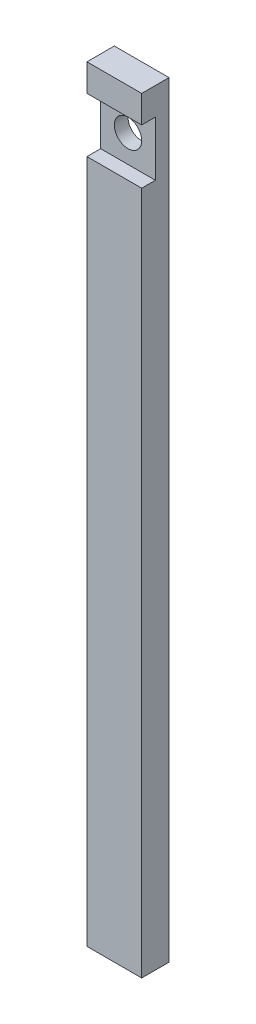
ISO-10303-21;
HEADER;
FILE_DESCRIPTION(('STEP AP214'),'2;1');
FILE_NAME('part.step','',(''),(''),'','','');
FILE_SCHEMA(('AUTOMOTIVE_DESIGN { 1 0 10303 214 1 1 1 1 }'));
ENDSEC;
DATA;
#1=APPLICATION_CONTEXT('core data for automotive mechanical design processes');
#2=APPLICATION_PROTOCOL_DEFINITION('international standard','automotive_design',2000,#1);
#3=PRODUCT_CONTEXT('',#1,'mechanical');
#4=PRODUCT('Part','Part','',(#3));
#5=PRODUCT_RELATED_PRODUCT_CATEGORY('part','',(#4));
#6=PRODUCT_DEFINITION_FORMATION('','',#4);
#7=PRODUCT_DEFINITION_CONTEXT('part definition',#1,'design');
#8=PRODUCT_DEFINITION('design','',#6,#7);
#9=PRODUCT_DEFINITION_SHAPE('','',#8);
#10=(LENGTH_UNIT() NAMED_UNIT(*) SI_UNIT(.MILLI.,.METRE.));
#11=(NAMED_UNIT(*) PLANE_ANGLE_UNIT() SI_UNIT($,.RADIAN.));
#12=(NAMED_UNIT(*) SI_UNIT($,.STERADIAN.) SOLID_ANGLE_UNIT());
#13=UNCERTAINTY_MEASURE_WITH_UNIT(LENGTH_MEASURE(1.E-05),#10,'distance_accuracy_value','');
#14=(GEOMETRIC_REPRESENTATION_CONTEXT(3) GLOBAL_UNCERTAINTY_ASSIGNED_CONTEXT((#13)) GLOBAL_UNIT_ASSIGNED_CONTEXT((#10,
#11,#12)) REPRESENTATION_CONTEXT('',''));
#15=CARTESIAN_POINT('',(0.,0.,0.));
#16=DIRECTION('',(0.,0.,1.));
#17=DIRECTION('',(1.,0.,0.));
#18=AXIS2_PLACEMENT_3D('',#15,#16,#17);
#19=CARTESIAN_POINT('',(0.,355.6,0.));
#20=DIRECTION('',(0.,0.,-1.));
#21=DIRECTION('',(-1.,0.,0.));
#22=AXIS2_PLACEMENT_3D('',#19,#20,#21);
#23=PLANE('',#22);
#24=DIRECTION('',(1.,0.,0.));
#25=VECTOR('',#24,1.);
#26=CARTESIAN_POINT('',(0.,317.5,0.));
#27=LINE('',#26,#25);
#28=CARTESIAN_POINT('',(0.,317.5,0.));
#29=VERTEX_POINT('',#28);
#30=CARTESIAN_POINT('',(25.4,317.5,0.));
#31=VERTEX_POINT('',#30);
#32=EDGE_CURVE('E111',#29,#31,#27,.T.);
#33=ORIENTED_EDGE('',*,*,#32,.F.);
#34=DIRECTION('',(0.,-1.,0.));
#35=VECTOR('',#34,1.);
#36=CARTESIAN_POINT('',(0.,355.6,0.));
#37=LINE('',#36,#35);
#38=CARTESIAN_POINT('',(0.,0.,0.));
#39=VERTEX_POINT('',#38);
#40=EDGE_CURVE('E50',#29,#39,#37,.T.);
#41=ORIENTED_EDGE('',*,*,#40,.T.);
#42=DIRECTION('',(1.,0.,0.));
#43=VECTOR('',#42,1.);
#44=CARTESIAN_POINT('',(0.,0.,0.));
#45=LINE('',#44,#43);
#46=CARTESIAN_POINT('',(25.4,0.,0.));
#47=VERTEX_POINT('',#46);
#48=EDGE_CURVE('E150',#39,#47,#45,.T.);
#49=ORIENTED_EDGE('',*,*,#48,.T.);
#50=DIRECTION('',(0.,-1.,0.));
#51=VECTOR('',#50,1.);
#52=CARTESIAN_POINT('',(25.4,355.6,0.));
#53=LINE('',#52,#51);
#54=EDGE_CURVE('E130',#31,#47,#53,.T.);
#55=ORIENTED_EDGE('',*,*,#54,.F.);
#56=EDGE_LOOP('',(#33,#41,#49,#55));
#57=FACE_BOUND('',#56,.T.);
#58=ADVANCED_FACE('F39',(#57),#23,.F.);
#59=CARTESIAN_POINT('',(25.4,355.6,0.));
#60=DIRECTION('',(-1.,0.,0.));
#61=DIRECTION('',(0.,0.,1.));
#62=AXIS2_PLACEMENT_3D('',#59,#60,#61);
#63=PLANE('',#62);
#64=DIRECTION('',(0.,0.,-1.));
#65=VECTOR('',#64,1.);
#66=CARTESIAN_POINT('',(25.4,317.5,0.));
#67=LINE('',#66,#65);
#68=CARTESIAN_POINT('',(25.4,317.5,-6.35));
#69=VERTEX_POINT('',#68);
#70=EDGE_CURVE('E53',#31,#69,#67,.T.);
#71=ORIENTED_EDGE('',*,*,#70,.F.);
#72=ORIENTED_EDGE('',*,*,#54,.T.);
#73=DIRECTION('',(0.,0.,-1.));
#74=VECTOR('',#73,1.);
#75=CARTESIAN_POINT('',(25.4,0.,0.));
#76=LINE('',#75,#74);
#77=CARTESIAN_POINT('',(25.4,0.,-12.7));
#78=VERTEX_POINT('',#77);
#79=EDGE_CURVE('E144',#47,#78,#76,.T.);
#80=ORIENTED_EDGE('',*,*,#79,.T.);
#81=DIRECTION('',(0.,-1.,0.));
#82=VECTOR('',#81,1.);
#83=CARTESIAN_POINT('',(25.4,355.6,-12.7));
#84=LINE('',#83,#82);
#85=CARTESIAN_POINT('',(25.4,355.6,-12.7));
#86=VERTEX_POINT('',#85);
#87=EDGE_CURVE('E137',#86,#78,#84,.T.);
#88=ORIENTED_EDGE('',*,*,#87,.F.);
#89=DIRECTION('',(0.,0.,-1.));
#90=VECTOR('',#89,1.);
#91=CARTESIAN_POINT('',(25.4,355.6,0.));
#92=LINE('',#91,#90);
#93=CARTESIAN_POINT('',(25.4,355.6,0.));
#94=VERTEX_POINT('',#93);
#95=EDGE_CURVE('E155',#94,#86,#92,.T.);
#96=ORIENTED_EDGE('',*,*,#95,.F.);
#97=CARTESIAN_POINT('',(25.4,342.9,0.));
#98=VERTEX_POINT('',#97);
#99=EDGE_CURVE('E135',#94,#98,#53,.T.);
#100=ORIENTED_EDGE('',*,*,#99,.T.);
#101=DIRECTION('',(0.,0.,1.));
#102=VECTOR('',#101,1.);
#103=CARTESIAN_POINT('',(25.4,342.9,0.));
#104=LINE('',#103,#102);
#105=CARTESIAN_POINT('',(25.4,342.9,-6.35));
#106=VERTEX_POINT('',#105);
#107=EDGE_CURVE('E121',#106,#98,#104,.T.);
#108=ORIENTED_EDGE('',*,*,#107,.F.);
#109=DIRECTION('',(0.,1.,0.));
#110=VECTOR('',#109,1.);
#111=CARTESIAN_POINT('',(25.4,342.9,-6.35));
#112=LINE('',#111,#110);
#113=EDGE_CURVE('E165',#69,#106,#112,.T.);
#114=ORIENTED_EDGE('',*,*,#113,.F.);
#115=EDGE_LOOP('',(#71,#72,#80,#88,#96,#100,#108,#114));
#116=FACE_BOUND('',#115,.T.);
#117=ADVANCED_FACE('F210',(#116),#63,.F.);
#118=CARTESIAN_POINT('',(0.,355.6,0.));
#119=DIRECTION('',(1.,0.,0.));
#120=DIRECTION('',(0.,0.,-1.));
#121=AXIS2_PLACEMENT_3D('',#118,#119,#120);
#122=PLANE('',#121);
#123=DIRECTION('',(0.,1.,0.));
#124=VECTOR('',#123,1.);
#125=CARTESIAN_POINT('',(0.,342.9,-6.35));
#126=LINE('',#125,#124);
#127=CARTESIAN_POINT('',(0.,317.5,-6.35));
#128=VERTEX_POINT('',#127);
#129=CARTESIAN_POINT('',(0.,342.9,-6.35));
#130=VERTEX_POINT('',#129);
#131=EDGE_CURVE('E117',#128,#130,#126,.T.);
#132=ORIENTED_EDGE('',*,*,#131,.T.);
#133=DIRECTION('',(0.,0.,1.));
#134=VECTOR('',#133,1.);
#135=CARTESIAN_POINT('',(0.,342.9,0.));
#136=LINE('',#135,#134);
#137=CARTESIAN_POINT('',(0.,342.9,0.));
#138=VERTEX_POINT('',#137);
#139=EDGE_CURVE('E126',#130,#138,#136,.T.);
#140=ORIENTED_EDGE('',*,*,#139,.T.);
#141=CARTESIAN_POINT('',(0.,355.6,0.));
#142=VERTEX_POINT('',#141);
#143=EDGE_CURVE('E11',#142,#138,#37,.T.);
#144=ORIENTED_EDGE('',*,*,#143,.F.);
#145=DIRECTION('',(0.,0.,1.));
#146=VECTOR('',#145,1.);
#147=CARTESIAN_POINT('',(0.,355.6,0.));
#148=LINE('',#147,#146);
#149=CARTESIAN_POINT('',(0.,355.6,-12.7));
#150=VERTEX_POINT('',#149);
#151=EDGE_CURVE('E145',#150,#142,#148,.T.);
#152=ORIENTED_EDGE('',*,*,#151,.F.);
#153=DIRECTION('',(0.,-1.,0.));
#154=VECTOR('',#153,1.);
#155=CARTESIAN_POINT('',(0.,355.6,-12.7));
#156=LINE('',#155,#154);
#157=CARTESIAN_POINT('',(0.,0.,-12.7));
#158=VERTEX_POINT('',#157);
#159=EDGE_CURVE('E143',#150,#158,#156,.T.);
#160=ORIENTED_EDGE('',*,*,#159,.T.);
#161=DIRECTION('',(0.,0.,1.));
#162=VECTOR('',#161,1.);
#163=CARTESIAN_POINT('',(0.,0.,0.));
#164=LINE('',#163,#162);
#165=EDGE_CURVE('E131',#158,#39,#164,.T.);
#166=ORIENTED_EDGE('',*,*,#165,.T.);
#167=ORIENTED_EDGE('',*,*,#40,.F.);
#168=DIRECTION('',(0.,0.,-1.));
#169=VECTOR('',#168,1.);
#170=CARTESIAN_POINT('',(0.,317.5,0.));
#171=LINE('',#170,#169);
#172=EDGE_CURVE('E112',#29,#128,#171,.T.);
#173=ORIENTED_EDGE('',*,*,#172,.T.);
#174=EDGE_LOOP('',(#132,#140,#144,#152,#160,#166,#167,#173));
#175=FACE_BOUND('',#174,.T.);
#176=ADVANCED_FACE('F41',(#175),#122,.F.);
#177=ORIENTED_EDGE('',*,*,#143,.T.);
#178=DIRECTION('',(1.,0.,0.));
#179=VECTOR('',#178,1.);
#180=CARTESIAN_POINT('',(0.,342.9,0.));
#181=LINE('',#180,#179);
#182=EDGE_CURVE('E147',#138,#98,#181,.T.);
#183=ORIENTED_EDGE('',*,*,#182,.T.);
#184=ORIENTED_EDGE('',*,*,#99,.F.);
#185=DIRECTION('',(1.,0.,0.));
#186=VECTOR('',#185,1.);
#187=CARTESIAN_POINT('',(0.,355.6,0.));
#188=LINE('',#187,#186);
#189=EDGE_CURVE('E93',#142,#94,#188,.T.);
#190=ORIENTED_EDGE('',*,*,#189,.F.);
#191=EDGE_LOOP('',(#177,#183,#184,#190));
#192=FACE_BOUND('',#191,.T.);
#193=ADVANCED_FACE('F211',(#192),#23,.F.);
#194=CARTESIAN_POINT('',(0.,355.6,-12.7));
#195=DIRECTION('',(0.,0.,1.));
#196=DIRECTION('',(1.,0.,0.));
#197=AXIS2_PLACEMENT_3D('',#194,#195,#196);
#198=PLANE('',#197);
#199=CARTESIAN_POINT('',(12.7,330.2,-12.7));
#200=DIRECTION('',(0.,0.,1.));
#201=DIRECTION('',(1.,0.,0.));
#202=AXIS2_PLACEMENT_3D('',#199,#200,#201);
#203=CIRCLE('',#202,6.35);
#204=CARTESIAN_POINT('',(19.05,330.2,-12.7));
#205=VERTEX_POINT('',#204);
#206=EDGE_CURVE('E167',#205,#205,#203,.T.);
#207=ORIENTED_EDGE('',*,*,#206,.T.);
#208=EDGE_LOOP('',(#207));
#209=FACE_BOUND('',#208,.T.);
#210=DIRECTION('',(-1.,0.,0.));
#211=VECTOR('',#210,1.);
#212=CARTESIAN_POINT('',(0.,0.,-12.7));
#213=LINE('',#212,#211);
#214=EDGE_CURVE('E83',#78,#158,#213,.T.);
#215=ORIENTED_EDGE('',*,*,#214,.T.);
#216=ORIENTED_EDGE('',*,*,#159,.F.);
#217=DIRECTION('',(-1.,0.,0.));
#218=VECTOR('',#217,1.);
#219=CARTESIAN_POINT('',(0.,355.6,-12.7));
#220=LINE('',#219,#218);
#221=EDGE_CURVE('E65',#86,#150,#220,.T.);
#222=ORIENTED_EDGE('',*,*,#221,.F.);
#223=ORIENTED_EDGE('',*,*,#87,.T.);
#224=EDGE_LOOP('',(#215,#216,#222,#223));
#225=FACE_BOUND('',#224,.T.);
#226=ADVANCED_FACE('F208',(#209,#225),#198,.F.);
#227=CARTESIAN_POINT('',(0.,355.6,0.));
#228=DIRECTION('',(0.,-1.,0.));
#229=DIRECTION('',(0.,0.,-1.));
#230=AXIS2_PLACEMENT_3D('',#227,#228,#229);
#231=PLANE('',#230);
#232=ORIENTED_EDGE('',*,*,#151,.T.);
#233=ORIENTED_EDGE('',*,*,#189,.T.);
#234=ORIENTED_EDGE('',*,*,#95,.T.);
#235=ORIENTED_EDGE('',*,*,#221,.T.);
#236=EDGE_LOOP('',(#232,#233,#234,#235));
#237=FACE_BOUND('',#236,.T.);
#238=ADVANCED_FACE('F203',(#237),#231,.F.);
#239=CARTESIAN_POINT('',(0.,0.,0.));
#240=DIRECTION('',(0.,-1.,0.));
#241=DIRECTION('',(0.,0.,-1.));
#242=AXIS2_PLACEMENT_3D('',#239,#240,#241);
#243=PLANE('',#242);
#244=CARTESIAN_POINT('',(6.35,0.,-6.35));
#245=DIRECTION('',(0.,-1.,0.));
#246=DIRECTION('',(0.,0.,-1.));
#247=AXIS2_PLACEMENT_3D('',#244,#245,#246);
#248=CIRCLE('',#247,3.175);
#249=CARTESIAN_POINT('',(6.35,0.,-9.525));
#250=VERTEX_POINT('',#249);
#251=EDGE_CURVE('E185',#250,#250,#248,.T.);
#252=ORIENTED_EDGE('',*,*,#251,.F.);
#253=EDGE_LOOP('',(#252));
#254=FACE_BOUND('',#253,.T.);
#255=CARTESIAN_POINT('',(19.05,0.,-6.35));
#256=DIRECTION('',(0.,-1.,0.));
#257=DIRECTION('',(0.,0.,-1.));
#258=AXIS2_PLACEMENT_3D('',#255,#256,#257);
#259=CIRCLE('',#258,3.175);
#260=CARTESIAN_POINT('',(19.05,0.,-9.525));
#261=VERTEX_POINT('',#260);
#262=EDGE_CURVE('E178',#261,#261,#259,.T.);
#263=ORIENTED_EDGE('',*,*,#262,.F.);
#264=EDGE_LOOP('',(#263));
#265=FACE_BOUND('',#264,.T.);
#266=ORIENTED_EDGE('',*,*,#165,.F.);
#267=ORIENTED_EDGE('',*,*,#214,.F.);
#268=ORIENTED_EDGE('',*,*,#79,.F.);
#269=ORIENTED_EDGE('',*,*,#48,.F.);
#270=EDGE_LOOP('',(#266,#267,#268,#269));
#271=FACE_BOUND('',#270,.T.);
#272=ADVANCED_FACE('F197',(#254,#265,#271),#243,.T.);
#273=CARTESIAN_POINT('',(0.,342.9,0.));
#274=DIRECTION('',(0.,1.,0.));
#275=DIRECTION('',(0.,0.,1.));
#276=AXIS2_PLACEMENT_3D('',#273,#274,#275);
#277=PLANE('',#276);
#278=ORIENTED_EDGE('',*,*,#107,.T.);
#279=ORIENTED_EDGE('',*,*,#182,.F.);
#280=ORIENTED_EDGE('',*,*,#139,.F.);
#281=DIRECTION('',(1.,0.,0.));
#282=VECTOR('',#281,1.);
#283=CARTESIAN_POINT('',(0.,342.9,-6.35));
#284=LINE('',#283,#282);
#285=EDGE_CURVE('E160',#130,#106,#284,.T.);
#286=ORIENTED_EDGE('',*,*,#285,.T.);
#287=EDGE_LOOP('',(#278,#279,#280,#286));
#288=FACE_BOUND('',#287,.T.);
#289=ADVANCED_FACE('F199',(#288),#277,.F.);
#290=CARTESIAN_POINT('',(0.,342.9,-6.35));
#291=DIRECTION('',(0.,0.,-1.));
#292=DIRECTION('',(0.,1.,0.));
#293=AXIS2_PLACEMENT_3D('',#290,#291,#292);
#294=PLANE('',#293);
#295=CARTESIAN_POINT('',(12.7,330.2,-6.3500000000001));
#296=DIRECTION('',(0.,0.,1.));
#297=DIRECTION('',(1.,0.,0.));
#298=AXIS2_PLACEMENT_3D('',#295,#296,#297);
#299=CIRCLE('',#298,6.35);
#300=CARTESIAN_POINT('',(19.05,330.2,-6.3500000000001));
#301=VERTEX_POINT('',#300);
#302=EDGE_CURVE('E168',#301,#301,#299,.T.);
#303=ORIENTED_EDGE('',*,*,#302,.F.);
#304=EDGE_LOOP('',(#303));
#305=FACE_BOUND('',#304,.T.);
#306=ORIENTED_EDGE('',*,*,#113,.T.);
#307=ORIENTED_EDGE('',*,*,#285,.F.);
#308=ORIENTED_EDGE('',*,*,#131,.F.);
#309=DIRECTION('',(1.,0.,0.));
#310=VECTOR('',#309,1.);
#311=CARTESIAN_POINT('',(0.,317.5,-6.35));
#312=LINE('',#311,#310);
#313=EDGE_CURVE('E113',#128,#69,#312,.T.);
#314=ORIENTED_EDGE('',*,*,#313,.T.);
#315=EDGE_LOOP('',(#306,#307,#308,#314));
#316=FACE_BOUND('',#315,.T.);
#317=ADVANCED_FACE('F214',(#305,#316),#294,.F.);
#318=CARTESIAN_POINT('',(0.,317.5,0.));
#319=DIRECTION('',(0.,-1.,0.));
#320=DIRECTION('',(0.,0.,-1.));
#321=AXIS2_PLACEMENT_3D('',#318,#319,#320);
#322=PLANE('',#321);
#323=ORIENTED_EDGE('',*,*,#70,.T.);
#324=ORIENTED_EDGE('',*,*,#313,.F.);
#325=ORIENTED_EDGE('',*,*,#172,.F.);
#326=ORIENTED_EDGE('',*,*,#32,.T.);
#327=EDGE_LOOP('',(#323,#324,#325,#326));
#328=FACE_BOUND('',#327,.T.);
#329=ADVANCED_FACE('F114',(#328),#322,.F.);
#330=CARTESIAN_POINT('',(12.7,330.2,-12.7));
#331=DIRECTION('',(0.,0.,1.));
#332=DIRECTION('',(1.,0.,0.));
#333=AXIS2_PLACEMENT_3D('',#330,#331,#332);
#334=CYLINDRICAL_SURFACE('',#333,6.35);
#335=ORIENTED_EDGE('',*,*,#206,.F.);
#336=EDGE_LOOP('',(#335));
#337=FACE_BOUND('',#336,.T.);
#338=ORIENTED_EDGE('',*,*,#302,.T.);
#339=EDGE_LOOP('',(#338));
#340=FACE_BOUND('',#339,.T.);
#341=ADVANCED_FACE('F223',(#337,#340),#334,.F.);
#342=CARTESIAN_POINT('',(19.05,25.4,-6.35));
#343=DIRECTION('',(0.,-1.,0.));
#344=DIRECTION('',(0.,0.,-1.));
#345=AXIS2_PLACEMENT_3D('',#342,#343,#344);
#346=CYLINDRICAL_SURFACE('',#345,3.175);
#347=CARTESIAN_POINT('',(19.05,25.4,-6.35));
#348=DIRECTION('',(0.,-1.,0.));
#349=DIRECTION('',(0.,0.,-1.));
#350=AXIS2_PLACEMENT_3D('',#347,#348,#349);
#351=CIRCLE('',#350,3.175);
#352=CARTESIAN_POINT('',(19.05,25.4,-9.525));
#353=VERTEX_POINT('',#352);
#354=EDGE_CURVE('E176',#353,#353,#351,.T.);
#355=ORIENTED_EDGE('',*,*,#354,.F.);
#356=EDGE_LOOP('',(#355));
#357=FACE_BOUND('',#356,.T.);
#358=ORIENTED_EDGE('',*,*,#262,.T.);
#359=EDGE_LOOP('',(#358));
#360=FACE_BOUND('',#359,.T.);
#361=ADVANCED_FACE('F276',(#357,#360),#346,.F.);
#362=CARTESIAN_POINT('',(19.05,25.4,-6.35));
#363=DIRECTION('',(0.,-1.,0.));
#364=DIRECTION('',(0.,0.,-1.));
#365=AXIS2_PLACEMENT_3D('',#362,#363,#364);
#366=PLANE('',#365);
#367=ORIENTED_EDGE('',*,*,#354,.T.);
#368=EDGE_LOOP('',(#367));
#369=FACE_BOUND('',#368,.T.);
#370=ADVANCED_FACE('F192',(#369),#366,.T.);
#371=CARTESIAN_POINT('',(6.35,25.4,-6.35));
#372=DIRECTION('',(0.,-1.,0.));
#373=DIRECTION('',(0.,0.,-1.));
#374=AXIS2_PLACEMENT_3D('',#371,#372,#373);
#375=CYLINDRICAL_SURFACE('',#374,3.175);
#376=CARTESIAN_POINT('',(6.35,25.4,-6.35));
#377=DIRECTION('',(0.,-1.,0.));
#378=DIRECTION('',(0.,0.,-1.));
#379=AXIS2_PLACEMENT_3D('',#376,#377,#378);
#380=CIRCLE('',#379,3.175);
#381=CARTESIAN_POINT('',(6.35,25.4,-9.525));
#382=VERTEX_POINT('',#381);
#383=EDGE_CURVE('E175',#382,#382,#380,.T.);
#384=ORIENTED_EDGE('',*,*,#383,.F.);
#385=EDGE_LOOP('',(#384));
#386=FACE_BOUND('',#385,.T.);
#387=ORIENTED_EDGE('',*,*,#251,.T.);
#388=EDGE_LOOP('',(#387));
#389=FACE_BOUND('',#388,.T.);
#390=ADVANCED_FACE('F187',(#386,#389),#375,.F.);
#391=CARTESIAN_POINT('',(6.35,25.4,-6.35));
#392=DIRECTION('',(0.,-1.,0.));
#393=DIRECTION('',(0.,0.,-1.));
#394=AXIS2_PLACEMENT_3D('',#391,#392,#393);
#395=PLANE('',#394);
#396=ORIENTED_EDGE('',*,*,#383,.T.);
#397=EDGE_LOOP('',(#396));
#398=FACE_BOUND('',#397,.T.);
#399=ADVANCED_FACE('F190',(#398),#395,.T.);
#400=CLOSED_SHELL('',(#58,#117,#176,#193,#226,#238,#272,#289,#317,#329,#341,#361,#370,#390,#399));
#401=MANIFOLD_SOLID_BREP('B2',#400);
#402=ADVANCED_BREP_SHAPE_REPRESENTATION('',(#18,#401),#14);
#403=SHAPE_DEFINITION_REPRESENTATION(#9,#402);
ENDSEC;
END-ISO-10303-21;
